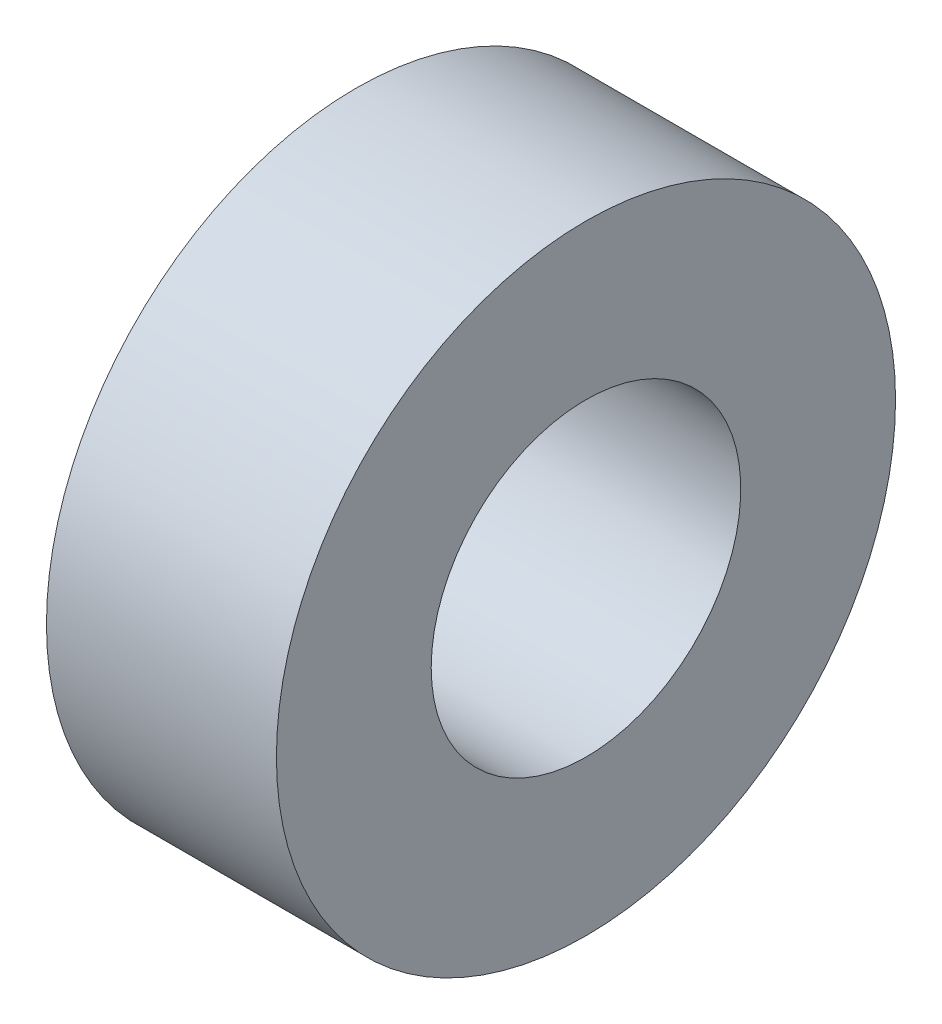
ISO-10303-21;
HEADER;
FILE_DESCRIPTION(('STEP AP214'),'2;1');
FILE_NAME('part.step','',(''),(''),'','','');
FILE_SCHEMA(('AUTOMOTIVE_DESIGN { 1 0 10303 214 1 1 1 1 }'));
ENDSEC;
DATA;
#1=APPLICATION_CONTEXT('core data for automotive mechanical design processes');
#2=APPLICATION_PROTOCOL_DEFINITION('international standard','automotive_design',2000,#1);
#3=PRODUCT_CONTEXT('',#1,'mechanical');
#4=PRODUCT('Part','Part','',(#3));
#5=PRODUCT_RELATED_PRODUCT_CATEGORY('part','',(#4));
#6=PRODUCT_DEFINITION_FORMATION('','',#4);
#7=PRODUCT_DEFINITION_CONTEXT('part definition',#1,'design');
#8=PRODUCT_DEFINITION('design','',#6,#7);
#9=PRODUCT_DEFINITION_SHAPE('','',#8);
#10=(LENGTH_UNIT() NAMED_UNIT(*) SI_UNIT(.MILLI.,.METRE.));
#11=(NAMED_UNIT(*) PLANE_ANGLE_UNIT() SI_UNIT($,.RADIAN.));
#12=(NAMED_UNIT(*) SI_UNIT($,.STERADIAN.) SOLID_ANGLE_UNIT());
#13=UNCERTAINTY_MEASURE_WITH_UNIT(LENGTH_MEASURE(1.E-05),#10,'distance_accuracy_value','');
#14=(GEOMETRIC_REPRESENTATION_CONTEXT(3) GLOBAL_UNCERTAINTY_ASSIGNED_CONTEXT((#13)) GLOBAL_UNIT_ASSIGNED_CONTEXT((#10,
#11,#12)) REPRESENTATION_CONTEXT('',''));
#15=CARTESIAN_POINT('',(0.,0.,0.));
#16=DIRECTION('',(0.,0.,1.));
#17=DIRECTION('',(1.,0.,0.));
#18=AXIS2_PLACEMENT_3D('',#15,#16,#17);
#19=CARTESIAN_POINT('',(85.1,149.6,0.));
#20=DIRECTION('',(1.,0.,0.));
#21=DIRECTION('',(0.,0.,-1.));
#22=AXIS2_PLACEMENT_3D('',#19,#20,#21);
#23=PLANE('',#22);
#24=CARTESIAN_POINT('',(85.1,146.1,0.));
#25=DIRECTION('',(-1.,0.,0.));
#26=DIRECTION('',(0.,0.,1.));
#27=AXIS2_PLACEMENT_3D('',#24,#25,#26);
#28=CIRCLE('',#27,1.75000000000001);
#29=CARTESIAN_POINT('',(85.1,146.1,1.75000000000001));
#30=VERTEX_POINT('',#29);
#31=EDGE_CURVE('E52',#30,#30,#28,.T.);
#32=ORIENTED_EDGE('',*,*,#31,.F.);
#33=EDGE_LOOP('',(#32));
#34=FACE_BOUND('',#33,.T.);
#35=CARTESIAN_POINT('',(85.1,146.1,0.));
#36=DIRECTION('',(-1.,0.,0.));
#37=DIRECTION('',(0.,0.,1.));
#38=AXIS2_PLACEMENT_3D('',#35,#36,#37);
#39=CIRCLE('',#38,3.49999999999999);
#40=CARTESIAN_POINT('',(85.1,146.1,3.49999999999999));
#41=VERTEX_POINT('',#40);
#42=EDGE_CURVE('E44',#41,#41,#39,.T.);
#43=ORIENTED_EDGE('',*,*,#42,.T.);
#44=EDGE_LOOP('',(#43));
#45=FACE_BOUND('',#44,.T.);
#46=ADVANCED_FACE('F38',(#34,#45),#23,.F.);
#47=CARTESIAN_POINT('',(87.7,149.6,0.));
#48=DIRECTION('',(-1.,0.,0.));
#49=DIRECTION('',(0.,0.,1.));
#50=AXIS2_PLACEMENT_3D('',#47,#48,#49);
#51=PLANE('',#50);
#52=CARTESIAN_POINT('',(87.7,146.1,0.));
#53=DIRECTION('',(-1.,0.,0.));
#54=DIRECTION('',(0.,0.,1.));
#55=AXIS2_PLACEMENT_3D('',#52,#53,#54);
#56=CIRCLE('',#55,1.75000000000001);
#57=CARTESIAN_POINT('',(87.7,146.1,1.75000000000001));
#58=VERTEX_POINT('',#57);
#59=EDGE_CURVE('E48',#58,#58,#56,.T.);
#60=ORIENTED_EDGE('',*,*,#59,.T.);
#61=EDGE_LOOP('',(#60));
#62=FACE_BOUND('',#61,.T.);
#63=CARTESIAN_POINT('',(87.7,146.1,0.));
#64=DIRECTION('',(-1.,0.,0.));
#65=DIRECTION('',(0.,0.,1.));
#66=AXIS2_PLACEMENT_3D('',#63,#64,#65);
#67=CIRCLE('',#66,3.49999999999999);
#68=CARTESIAN_POINT('',(87.7,146.1,3.49999999999999));
#69=VERTEX_POINT('',#68);
#70=EDGE_CURVE('E10',#69,#69,#67,.T.);
#71=ORIENTED_EDGE('',*,*,#70,.F.);
#72=EDGE_LOOP('',(#71));
#73=FACE_BOUND('',#72,.T.);
#74=ADVANCED_FACE('F62',(#62,#73),#51,.F.);
#75=CARTESIAN_POINT('',(85.1,146.1,0.));
#76=DIRECTION('',(-1.,0.,0.));
#77=DIRECTION('',(0.,0.,1.));
#78=AXIS2_PLACEMENT_3D('',#75,#76,#77);
#79=CYLINDRICAL_SURFACE('',#78,3.49999999999999);
#80=ORIENTED_EDGE('',*,*,#42,.F.);
#81=EDGE_LOOP('',(#80));
#82=FACE_BOUND('',#81,.T.);
#83=ORIENTED_EDGE('',*,*,#70,.T.);
#84=EDGE_LOOP('',(#83));
#85=FACE_BOUND('',#84,.T.);
#86=ADVANCED_FACE('F66',(#82,#85),#79,.T.);
#87=CARTESIAN_POINT('',(85.1,146.1,0.));
#88=DIRECTION('',(-1.,0.,0.));
#89=DIRECTION('',(0.,0.,1.));
#90=AXIS2_PLACEMENT_3D('',#87,#88,#89);
#91=CYLINDRICAL_SURFACE('',#90,1.75000000000001);
#92=ORIENTED_EDGE('',*,*,#31,.T.);
#93=EDGE_LOOP('',(#92));
#94=FACE_BOUND('',#93,.T.);
#95=ORIENTED_EDGE('',*,*,#59,.F.);
#96=EDGE_LOOP('',(#95));
#97=FACE_BOUND('',#96,.T.);
#98=ADVANCED_FACE('F58',(#94,#97),#91,.F.);
#99=CLOSED_SHELL('',(#46,#74,#86,#98));
#100=MANIFOLD_SOLID_BREP('B2',#99);
#101=ADVANCED_BREP_SHAPE_REPRESENTATION('',(#18,#100),#14);
#102=SHAPE_DEFINITION_REPRESENTATION(#9,#101);
ENDSEC;
END-ISO-10303-21;
